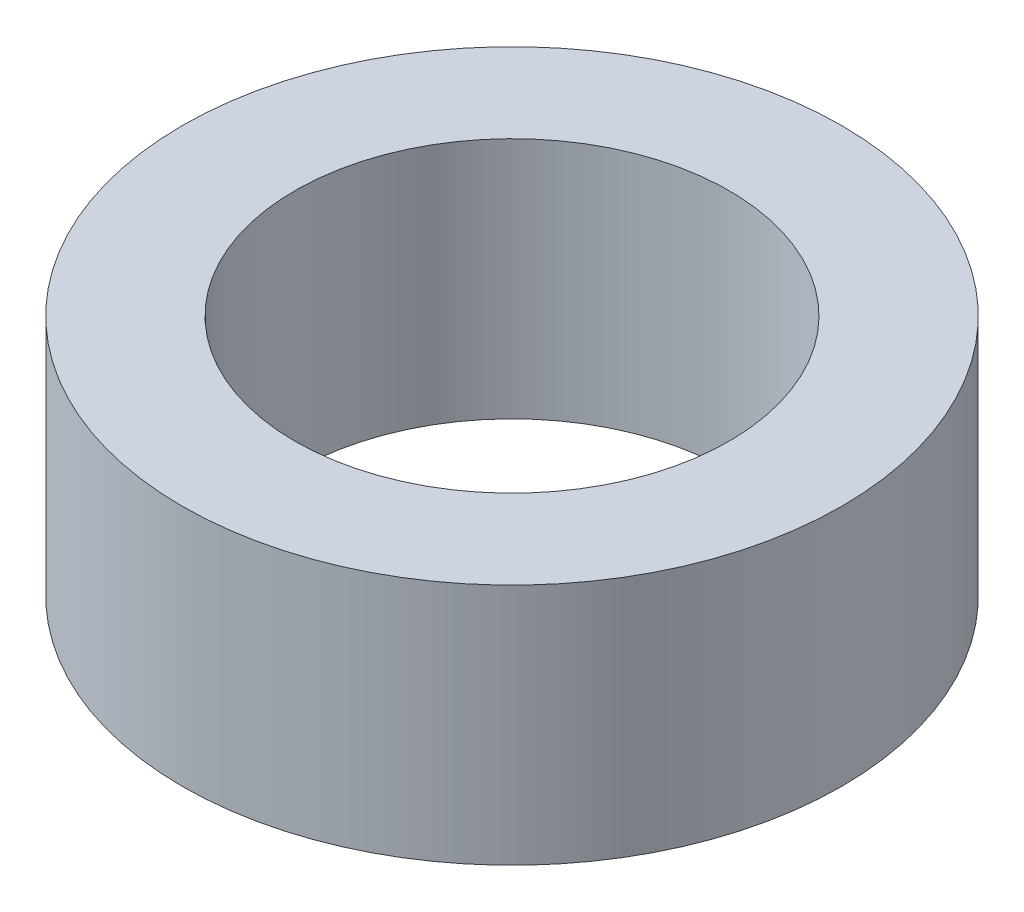
ISO-10303-21;
HEADER;
FILE_DESCRIPTION(('STEP AP214'),'2;1');
FILE_NAME('part.step','',(''),(''),'','','');
FILE_SCHEMA(('AUTOMOTIVE_DESIGN { 1 0 10303 214 1 1 1 1 }'));
ENDSEC;
DATA;
#1=APPLICATION_CONTEXT('core data for automotive mechanical design processes');
#2=APPLICATION_PROTOCOL_DEFINITION('international standard','automotive_design',2000,#1);
#3=PRODUCT_CONTEXT('',#1,'mechanical');
#4=PRODUCT('Part','Part','',(#3));
#5=PRODUCT_RELATED_PRODUCT_CATEGORY('part','',(#4));
#6=PRODUCT_DEFINITION_FORMATION('','',#4);
#7=PRODUCT_DEFINITION_CONTEXT('part definition',#1,'design');
#8=PRODUCT_DEFINITION('design','',#6,#7);
#9=PRODUCT_DEFINITION_SHAPE('','',#8);
#10=(LENGTH_UNIT() NAMED_UNIT(*) SI_UNIT(.MILLI.,.METRE.));
#11=(NAMED_UNIT(*) PLANE_ANGLE_UNIT() SI_UNIT($,.RADIAN.));
#12=(NAMED_UNIT(*) SI_UNIT($,.STERADIAN.) SOLID_ANGLE_UNIT());
#13=UNCERTAINTY_MEASURE_WITH_UNIT(LENGTH_MEASURE(1.E-05),#10,'distance_accuracy_value','');
#14=(GEOMETRIC_REPRESENTATION_CONTEXT(3) GLOBAL_UNCERTAINTY_ASSIGNED_CONTEXT((#13)) GLOBAL_UNIT_ASSIGNED_CONTEXT((#10,
#11,#12)) REPRESENTATION_CONTEXT('',''));
#15=CARTESIAN_POINT('',(0.,0.,0.));
#16=DIRECTION('',(0.,0.,1.));
#17=DIRECTION('',(1.,0.,0.));
#18=AXIS2_PLACEMENT_3D('',#15,#16,#17);
#19=CARTESIAN_POINT('',(0.,4.4704,0.));
#20=DIRECTION('',(0.,1.,0.));
#21=DIRECTION('',(0.,0.,1.));
#22=AXIS2_PLACEMENT_3D('',#19,#20,#21);
#23=PLANE('',#22);
#24=CARTESIAN_POINT('',(0.,4.4704,0.));
#25=DIRECTION('',(0.,1.,0.));
#26=DIRECTION('',(0.,0.,1.));
#27=AXIS2_PLACEMENT_3D('',#24,#25,#26);
#28=CIRCLE('',#27,6.075);
#29=CARTESIAN_POINT('',(0.,4.4704,6.075));
#30=VERTEX_POINT('',#29);
#31=EDGE_CURVE('E10',#30,#30,#28,.T.);
#32=ORIENTED_EDGE('',*,*,#31,.T.);
#33=EDGE_LOOP('',(#32));
#34=FACE_BOUND('',#33,.T.);
#35=CARTESIAN_POINT('',(0.,4.4704,0.));
#36=DIRECTION('',(0.,1.,0.));
#37=DIRECTION('',(0.,0.,1.));
#38=AXIS2_PLACEMENT_3D('',#35,#36,#37);
#39=CIRCLE('',#38,4.);
#40=CARTESIAN_POINT('',(0.,4.4704,4.));
#41=VERTEX_POINT('',#40);
#42=EDGE_CURVE('E50',#41,#41,#39,.T.);
#43=ORIENTED_EDGE('',*,*,#42,.F.);
#44=EDGE_LOOP('',(#43));
#45=FACE_BOUND('',#44,.T.);
#46=ADVANCED_FACE('F37',(#34,#45),#23,.T.);
#47=CARTESIAN_POINT('',(0.,0.,0.));
#48=DIRECTION('',(0.,1.,0.));
#49=DIRECTION('',(0.,0.,1.));
#50=AXIS2_PLACEMENT_3D('',#47,#48,#49);
#51=PLANE('',#50);
#52=CARTESIAN_POINT('',(0.,0.,0.));
#53=DIRECTION('',(0.,1.,0.));
#54=DIRECTION('',(0.,0.,1.));
#55=AXIS2_PLACEMENT_3D('',#52,#53,#54);
#56=CIRCLE('',#55,6.075);
#57=CARTESIAN_POINT('',(0.,0.,6.075));
#58=VERTEX_POINT('',#57);
#59=EDGE_CURVE('E41',#58,#58,#56,.T.);
#60=ORIENTED_EDGE('',*,*,#59,.F.);
#61=EDGE_LOOP('',(#60));
#62=FACE_BOUND('',#61,.T.);
#63=CARTESIAN_POINT('',(0.,0.,0.));
#64=DIRECTION('',(0.,1.,0.));
#65=DIRECTION('',(0.,0.,1.));
#66=AXIS2_PLACEMENT_3D('',#63,#64,#65);
#67=CIRCLE('',#66,4.);
#68=CARTESIAN_POINT('',(0.,0.,4.));
#69=VERTEX_POINT('',#68);
#70=EDGE_CURVE('E52',#69,#69,#67,.T.);
#71=ORIENTED_EDGE('',*,*,#70,.T.);
#72=EDGE_LOOP('',(#71));
#73=FACE_BOUND('',#72,.T.);
#74=ADVANCED_FACE('F64',(#62,#73),#51,.F.);
#75=CARTESIAN_POINT('',(0.,4.4704,0.));
#76=DIRECTION('',(0.,-1.,0.));
#77=DIRECTION('',(0.,0.,-1.));
#78=AXIS2_PLACEMENT_3D('',#75,#76,#77);
#79=CYLINDRICAL_SURFACE('',#78,6.075);
#80=ORIENTED_EDGE('',*,*,#31,.F.);
#81=EDGE_LOOP('',(#80));
#82=FACE_BOUND('',#81,.T.);
#83=ORIENTED_EDGE('',*,*,#59,.T.);
#84=EDGE_LOOP('',(#83));
#85=FACE_BOUND('',#84,.T.);
#86=ADVANCED_FACE('F39',(#82,#85),#79,.T.);
#87=CARTESIAN_POINT('',(0.,4.4704,0.));
#88=DIRECTION('',(0.,-1.,0.));
#89=DIRECTION('',(0.,0.,-1.));
#90=AXIS2_PLACEMENT_3D('',#87,#88,#89);
#91=CYLINDRICAL_SURFACE('',#90,4.);
#92=ORIENTED_EDGE('',*,*,#42,.T.);
#93=EDGE_LOOP('',(#92));
#94=FACE_BOUND('',#93,.T.);
#95=ORIENTED_EDGE('',*,*,#70,.F.);
#96=EDGE_LOOP('',(#95));
#97=FACE_BOUND('',#96,.T.);
#98=ADVANCED_FACE('F60',(#94,#97),#91,.F.);
#99=CLOSED_SHELL('',(#46,#74,#86,#98));
#100=MANIFOLD_SOLID_BREP('B2',#99);
#101=ADVANCED_BREP_SHAPE_REPRESENTATION('',(#18,#100),#14);
#102=SHAPE_DEFINITION_REPRESENTATION(#9,#101);
ENDSEC;
END-ISO-10303-21;
